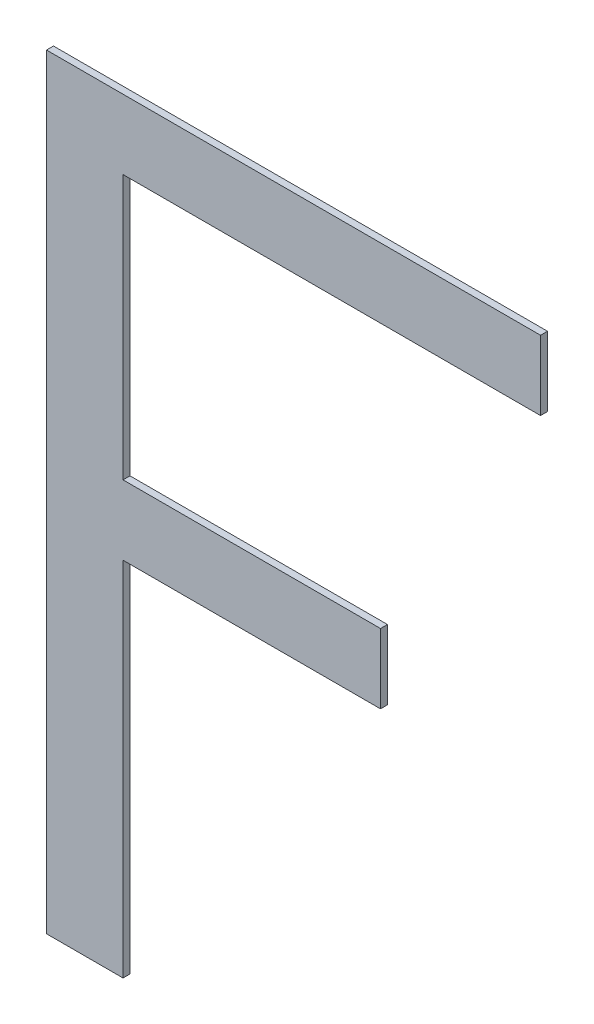
ISO-10303-21;
HEADER;
FILE_DESCRIPTION(('STEP AP214'),'2;1');
FILE_NAME('part.step','',(''),(''),'','','');
FILE_SCHEMA(('AUTOMOTIVE_DESIGN { 1 0 10303 214 1 1 1 1 }'));
ENDSEC;
DATA;
#1=APPLICATION_CONTEXT('core data for automotive mechanical design processes');
#2=APPLICATION_PROTOCOL_DEFINITION('international standard','automotive_design',2000,#1);
#3=PRODUCT_CONTEXT('',#1,'mechanical');
#4=PRODUCT('Part','Part','',(#3));
#5=PRODUCT_RELATED_PRODUCT_CATEGORY('part','',(#4));
#6=PRODUCT_DEFINITION_FORMATION('','',#4);
#7=PRODUCT_DEFINITION_CONTEXT('part definition',#1,'design');
#8=PRODUCT_DEFINITION('design','',#6,#7);
#9=PRODUCT_DEFINITION_SHAPE('','',#8);
#10=(LENGTH_UNIT() NAMED_UNIT(*) SI_UNIT(.MILLI.,.METRE.));
#11=(NAMED_UNIT(*) PLANE_ANGLE_UNIT() SI_UNIT($,.RADIAN.));
#12=(NAMED_UNIT(*) SI_UNIT($,.STERADIAN.) SOLID_ANGLE_UNIT());
#13=UNCERTAINTY_MEASURE_WITH_UNIT(LENGTH_MEASURE(1.E-05),#10,'distance_accuracy_value','');
#14=(GEOMETRIC_REPRESENTATION_CONTEXT(3) GLOBAL_UNCERTAINTY_ASSIGNED_CONTEXT((#13)) GLOBAL_UNIT_ASSIGNED_CONTEXT((#10,
#11,#12)) REPRESENTATION_CONTEXT('',''));
#15=CARTESIAN_POINT('',(0.,0.,0.));
#16=DIRECTION('',(0.,0.,1.));
#17=DIRECTION('',(1.,0.,0.));
#18=AXIS2_PLACEMENT_3D('',#15,#16,#17);
#19=CARTESIAN_POINT('',(-0.35500056,-0.5499989,0.01));
#20=DIRECTION('',(0.,0.,1.));
#21=DIRECTION('',(1.,0.,0.));
#22=AXIS2_PLACEMENT_3D('',#19,#20,#21);
#23=PLANE('',#22);
#24=DIRECTION('',(1.,0.,0.));
#25=VECTOR('',#24,1.);
#26=CARTESIAN_POINT('',(-0.35500056,0.55000144,0.01));
#27=LINE('',#26,#25);
#28=CARTESIAN_POINT('',(-0.35500056,0.55000144,0.01));
#29=VERTEX_POINT('',#28);
#30=CARTESIAN_POINT('',(0.35500056,0.55000144,0.01));
#31=VERTEX_POINT('',#30);
#32=EDGE_CURVE('E137',#29,#31,#27,.T.);
#33=ORIENTED_EDGE('',*,*,#32,.F.);
#34=DIRECTION('',(0.,1.,0.));
#35=VECTOR('',#34,1.);
#36=CARTESIAN_POINT('',(-0.35500056,-0.5499989,0.01));
#37=LINE('',#36,#35);
#38=CARTESIAN_POINT('',(-0.35500056,-0.5499989,0.01));
#39=VERTEX_POINT('',#38);
#40=EDGE_CURVE('E106',#39,#29,#37,.T.);
#41=ORIENTED_EDGE('',*,*,#40,.F.);
#42=DIRECTION('',(1.,0.,0.));
#43=VECTOR('',#42,1.);
#44=CARTESIAN_POINT('',(-0.24500078,-0.5499989,0.01));
#45=LINE('',#44,#43);
#46=CARTESIAN_POINT('',(-0.24500078,-0.5499989,0.01));
#47=VERTEX_POINT('',#46);
#48=EDGE_CURVE('E20',#47,#39,#45,.F.);
#49=ORIENTED_EDGE('',*,*,#48,.F.);
#50=DIRECTION('',(0.,1.,0.));
#51=VECTOR('',#50,1.);
#52=CARTESIAN_POINT('',(-0.24500078,-0.02999994,0.01));
#53=LINE('',#52,#51);
#54=CARTESIAN_POINT('',(-0.24500078,-0.02999994,0.01));
#55=VERTEX_POINT('',#54);
#56=EDGE_CURVE('E95',#55,#47,#53,.F.);
#57=ORIENTED_EDGE('',*,*,#56,.F.);
#58=DIRECTION('',(1.,0.,0.));
#59=VECTOR('',#58,1.);
#60=CARTESIAN_POINT('',(0.12500102,-0.02999994,0.01));
#61=LINE('',#60,#59);
#62=CARTESIAN_POINT('',(0.12500102,-0.02999994,0.01));
#63=VERTEX_POINT('',#62);
#64=EDGE_CURVE('E90',#63,#55,#61,.F.);
#65=ORIENTED_EDGE('',*,*,#64,.F.);
#66=DIRECTION('',(0.,1.,0.));
#67=VECTOR('',#66,1.);
#68=CARTESIAN_POINT('',(0.12500102,0.06999986,0.01));
#69=LINE('',#68,#67);
#70=CARTESIAN_POINT('',(0.12500102,0.06999986,0.01));
#71=VERTEX_POINT('',#70);
#72=EDGE_CURVE('E117',#71,#63,#69,.F.);
#73=ORIENTED_EDGE('',*,*,#72,.F.);
#74=DIRECTION('',(1.,0.,0.));
#75=VECTOR('',#74,1.);
#76=CARTESIAN_POINT('',(-0.24500078,0.06999986,0.01));
#77=LINE('',#76,#75);
#78=CARTESIAN_POINT('',(-0.24500078,0.06999986,0.01));
#79=VERTEX_POINT('',#78);
#80=EDGE_CURVE('E121',#79,#71,#77,.T.);
#81=ORIENTED_EDGE('',*,*,#80,.F.);
#82=DIRECTION('',(0.,1.,0.));
#83=VECTOR('',#82,1.);
#84=CARTESIAN_POINT('',(-0.24500078,0.45000164,0.01));
#85=LINE('',#84,#83);
#86=CARTESIAN_POINT('',(-0.24500078,0.45000164,0.01));
#87=VERTEX_POINT('',#86);
#88=EDGE_CURVE('E125',#87,#79,#85,.F.);
#89=ORIENTED_EDGE('',*,*,#88,.F.);
#90=DIRECTION('',(1.,0.,0.));
#91=VECTOR('',#90,1.);
#92=CARTESIAN_POINT('',(0.35500056,0.45000164,0.01));
#93=LINE('',#92,#91);
#94=CARTESIAN_POINT('',(0.35500056,0.45000164,0.01));
#95=VERTEX_POINT('',#94);
#96=EDGE_CURVE('E129',#95,#87,#93,.F.);
#97=ORIENTED_EDGE('',*,*,#96,.F.);
#98=DIRECTION('',(0.,1.,0.));
#99=VECTOR('',#98,1.);
#100=CARTESIAN_POINT('',(0.35500056,0.55000144,0.01));
#101=LINE('',#100,#99);
#102=EDGE_CURVE('E133',#31,#95,#101,.F.);
#103=ORIENTED_EDGE('',*,*,#102,.F.);
#104=EDGE_LOOP('',(#33,#41,#49,#57,#65,#73,#81,#89,#97,#103));
#105=FACE_BOUND('',#104,.T.);
#106=ADVANCED_FACE('F17',(#105),#23,.T.);
#107=CARTESIAN_POINT('',(-0.24500078,-0.5499989,0.));
#108=DIRECTION('',(0.,-1.,0.));
#109=DIRECTION('',(0.,0.,-1.));
#110=AXIS2_PLACEMENT_3D('',#107,#108,#109);
#111=PLANE('',#110);
#112=DIRECTION('',(0.,0.,1.));
#113=VECTOR('',#112,1.);
#114=CARTESIAN_POINT('',(-0.35500056,-0.5499989,0.));
#115=LINE('',#114,#113);
#116=CARTESIAN_POINT('',(-0.35500056,-0.5499989,0.));
#117=VERTEX_POINT('',#116);
#118=EDGE_CURVE('E141',#117,#39,#115,.T.);
#119=ORIENTED_EDGE('',*,*,#118,.F.);
#120=DIRECTION('',(1.,0.,0.));
#121=VECTOR('',#120,1.);
#122=CARTESIAN_POINT('',(-0.35500056,-0.5499989,0.));
#123=LINE('',#122,#121);
#124=CARTESIAN_POINT('',(-0.24500078,-0.5499989,0.));
#125=VERTEX_POINT('',#124);
#126=EDGE_CURVE('E112',#117,#125,#123,.T.);
#127=ORIENTED_EDGE('',*,*,#126,.T.);
#128=DIRECTION('',(0.,0.,-1.));
#129=VECTOR('',#128,1.);
#130=CARTESIAN_POINT('',(-0.24500078,-0.5499989,0.));
#131=LINE('',#130,#129);
#132=EDGE_CURVE('E100',#47,#125,#131,.T.);
#133=ORIENTED_EDGE('',*,*,#132,.F.);
#134=ORIENTED_EDGE('',*,*,#48,.T.);
#135=EDGE_LOOP('',(#119,#127,#133,#134));
#136=FACE_BOUND('',#135,.T.);
#137=ADVANCED_FACE('F111',(#136),#111,.T.);
#138=CARTESIAN_POINT('',(-0.24500078,-0.02999994,0.));
#139=DIRECTION('',(1.,0.,0.));
#140=DIRECTION('',(0.,0.,-1.));
#141=AXIS2_PLACEMENT_3D('',#138,#139,#140);
#142=PLANE('',#141);
#143=ORIENTED_EDGE('',*,*,#132,.T.);
#144=DIRECTION('',(0.,1.,0.));
#145=VECTOR('',#144,1.);
#146=CARTESIAN_POINT('',(-0.24500078,-0.5499989,0.));
#147=LINE('',#146,#145);
#148=CARTESIAN_POINT('',(-0.24500078,-0.02999994,0.));
#149=VERTEX_POINT('',#148);
#150=EDGE_CURVE('E146',#125,#149,#147,.T.);
#151=ORIENTED_EDGE('',*,*,#150,.T.);
#152=DIRECTION('',(0.,0.,-1.));
#153=VECTOR('',#152,1.);
#154=CARTESIAN_POINT('',(-0.24500078,-0.02999994,0.));
#155=LINE('',#154,#153);
#156=EDGE_CURVE('E102',#55,#149,#155,.T.);
#157=ORIENTED_EDGE('',*,*,#156,.F.);
#158=ORIENTED_EDGE('',*,*,#56,.T.);
#159=EDGE_LOOP('',(#143,#151,#157,#158));
#160=FACE_BOUND('',#159,.T.);
#161=ADVANCED_FACE('F97',(#160),#142,.T.);
#162=CARTESIAN_POINT('',(0.12500102,-0.02999994,0.));
#163=DIRECTION('',(0.,-1.,0.));
#164=DIRECTION('',(0.,0.,-1.));
#165=AXIS2_PLACEMENT_3D('',#162,#163,#164);
#166=PLANE('',#165);
#167=ORIENTED_EDGE('',*,*,#156,.T.);
#168=DIRECTION('',(1.,0.,0.));
#169=VECTOR('',#168,1.);
#170=CARTESIAN_POINT('',(-0.35500056,-0.02999994,0.));
#171=LINE('',#170,#169);
#172=CARTESIAN_POINT('',(0.12500102,-0.02999994,0.));
#173=VERTEX_POINT('',#172);
#174=EDGE_CURVE('E148',#149,#173,#171,.T.);
#175=ORIENTED_EDGE('',*,*,#174,.T.);
#176=DIRECTION('',(0.,0.,-1.));
#177=VECTOR('',#176,1.);
#178=CARTESIAN_POINT('',(0.12500102,-0.02999994,0.));
#179=LINE('',#178,#177);
#180=EDGE_CURVE('E119',#63,#173,#179,.T.);
#181=ORIENTED_EDGE('',*,*,#180,.F.);
#182=ORIENTED_EDGE('',*,*,#64,.T.);
#183=EDGE_LOOP('',(#167,#175,#181,#182));
#184=FACE_BOUND('',#183,.T.);
#185=ADVANCED_FACE('F198',(#184),#166,.T.);
#186=CARTESIAN_POINT('',(0.12500102,0.06999986,0.));
#187=DIRECTION('',(1.,0.,0.));
#188=DIRECTION('',(0.,0.,-1.));
#189=AXIS2_PLACEMENT_3D('',#186,#187,#188);
#190=PLANE('',#189);
#191=ORIENTED_EDGE('',*,*,#180,.T.);
#192=DIRECTION('',(0.,1.,0.));
#193=VECTOR('',#192,1.);
#194=CARTESIAN_POINT('',(0.12500102,-0.5499989,0.));
#195=LINE('',#194,#193);
#196=CARTESIAN_POINT('',(0.12500102,0.06999986,0.));
#197=VERTEX_POINT('',#196);
#198=EDGE_CURVE('E151',#173,#197,#195,.T.);
#199=ORIENTED_EDGE('',*,*,#198,.T.);
#200=DIRECTION('',(0.,0.,1.));
#201=VECTOR('',#200,1.);
#202=CARTESIAN_POINT('',(0.12500102,0.06999986,0.));
#203=LINE('',#202,#201);
#204=EDGE_CURVE('E123',#71,#197,#203,.F.);
#205=ORIENTED_EDGE('',*,*,#204,.F.);
#206=ORIENTED_EDGE('',*,*,#72,.T.);
#207=EDGE_LOOP('',(#191,#199,#205,#206));
#208=FACE_BOUND('',#207,.T.);
#209=ADVANCED_FACE('F197',(#208),#190,.T.);
#210=CARTESIAN_POINT('',(-0.24500078,0.06999986,0.));
#211=DIRECTION('',(0.,1.,0.));
#212=DIRECTION('',(0.,0.,1.));
#213=AXIS2_PLACEMENT_3D('',#210,#211,#212);
#214=PLANE('',#213);
#215=ORIENTED_EDGE('',*,*,#204,.T.);
#216=DIRECTION('',(1.,0.,0.));
#217=VECTOR('',#216,1.);
#218=CARTESIAN_POINT('',(-0.35500056,0.06999986,0.));
#219=LINE('',#218,#217);
#220=CARTESIAN_POINT('',(-0.24500078,0.06999986,0.));
#221=VERTEX_POINT('',#220);
#222=EDGE_CURVE('E154',#197,#221,#219,.F.);
#223=ORIENTED_EDGE('',*,*,#222,.T.);
#224=DIRECTION('',(0.,0.,-1.));
#225=VECTOR('',#224,1.);
#226=CARTESIAN_POINT('',(-0.24500078,0.06999986,0.));
#227=LINE('',#226,#225);
#228=EDGE_CURVE('E127',#79,#221,#227,.T.);
#229=ORIENTED_EDGE('',*,*,#228,.F.);
#230=ORIENTED_EDGE('',*,*,#80,.T.);
#231=EDGE_LOOP('',(#215,#223,#229,#230));
#232=FACE_BOUND('',#231,.T.);
#233=ADVANCED_FACE('F191',(#232),#214,.T.);
#234=CARTESIAN_POINT('',(-0.24500078,0.45000164,0.));
#235=DIRECTION('',(1.,0.,0.));
#236=DIRECTION('',(0.,0.,-1.));
#237=AXIS2_PLACEMENT_3D('',#234,#235,#236);
#238=PLANE('',#237);
#239=ORIENTED_EDGE('',*,*,#228,.T.);
#240=DIRECTION('',(0.,1.,0.));
#241=VECTOR('',#240,1.);
#242=CARTESIAN_POINT('',(-0.24500078,-0.5499989,0.));
#243=LINE('',#242,#241);
#244=CARTESIAN_POINT('',(-0.24500078,0.45000164,0.));
#245=VERTEX_POINT('',#244);
#246=EDGE_CURVE('E157',#221,#245,#243,.T.);
#247=ORIENTED_EDGE('',*,*,#246,.T.);
#248=DIRECTION('',(0.,0.,-1.));
#249=VECTOR('',#248,1.);
#250=CARTESIAN_POINT('',(-0.24500078,0.45000164,0.));
#251=LINE('',#250,#249);
#252=EDGE_CURVE('E131',#87,#245,#251,.T.);
#253=ORIENTED_EDGE('',*,*,#252,.F.);
#254=ORIENTED_EDGE('',*,*,#88,.T.);
#255=EDGE_LOOP('',(#239,#247,#253,#254));
#256=FACE_BOUND('',#255,.T.);
#257=ADVANCED_FACE('F187',(#256),#238,.T.);
#258=CARTESIAN_POINT('',(0.35500056,0.45000164,0.));
#259=DIRECTION('',(0.,-1.,0.));
#260=DIRECTION('',(0.,0.,-1.));
#261=AXIS2_PLACEMENT_3D('',#258,#259,#260);
#262=PLANE('',#261);
#263=ORIENTED_EDGE('',*,*,#252,.T.);
#264=DIRECTION('',(1.,0.,0.));
#265=VECTOR('',#264,1.);
#266=CARTESIAN_POINT('',(-0.35500056,0.45000164,0.));
#267=LINE('',#266,#265);
#268=CARTESIAN_POINT('',(0.35500056,0.45000164,0.));
#269=VERTEX_POINT('',#268);
#270=EDGE_CURVE('E160',#245,#269,#267,.T.);
#271=ORIENTED_EDGE('',*,*,#270,.T.);
#272=DIRECTION('',(0.,0.,-1.));
#273=VECTOR('',#272,1.);
#274=CARTESIAN_POINT('',(0.35500056,0.45000164,0.));
#275=LINE('',#274,#273);
#276=EDGE_CURVE('E135',#95,#269,#275,.T.);
#277=ORIENTED_EDGE('',*,*,#276,.F.);
#278=ORIENTED_EDGE('',*,*,#96,.T.);
#279=EDGE_LOOP('',(#263,#271,#277,#278));
#280=FACE_BOUND('',#279,.T.);
#281=ADVANCED_FACE('F181',(#280),#262,.T.);
#282=CARTESIAN_POINT('',(0.35500056,0.55000144,0.));
#283=DIRECTION('',(1.,0.,0.));
#284=DIRECTION('',(0.,0.,-1.));
#285=AXIS2_PLACEMENT_3D('',#282,#283,#284);
#286=PLANE('',#285);
#287=ORIENTED_EDGE('',*,*,#276,.T.);
#288=DIRECTION('',(0.,1.,0.));
#289=VECTOR('',#288,1.);
#290=CARTESIAN_POINT('',(0.35500056,-0.5499989,0.));
#291=LINE('',#290,#289);
#292=CARTESIAN_POINT('',(0.35500056,0.55000144,0.));
#293=VERTEX_POINT('',#292);
#294=EDGE_CURVE('E163',#269,#293,#291,.T.);
#295=ORIENTED_EDGE('',*,*,#294,.T.);
#296=DIRECTION('',(0.,0.,1.));
#297=VECTOR('',#296,1.);
#298=CARTESIAN_POINT('',(0.35500056,0.55000144,0.));
#299=LINE('',#298,#297);
#300=EDGE_CURVE('E139',#31,#293,#299,.F.);
#301=ORIENTED_EDGE('',*,*,#300,.F.);
#302=ORIENTED_EDGE('',*,*,#102,.T.);
#303=EDGE_LOOP('',(#287,#295,#301,#302));
#304=FACE_BOUND('',#303,.T.);
#305=ADVANCED_FACE('F176',(#304),#286,.T.);
#306=CARTESIAN_POINT('',(-0.35500056,0.55000144,0.));
#307=DIRECTION('',(0.,1.,0.));
#308=DIRECTION('',(0.,0.,1.));
#309=AXIS2_PLACEMENT_3D('',#306,#307,#308);
#310=PLANE('',#309);
#311=ORIENTED_EDGE('',*,*,#300,.T.);
#312=DIRECTION('',(1.,0.,0.));
#313=VECTOR('',#312,1.);
#314=CARTESIAN_POINT('',(-0.35500056,0.55000144,0.));
#315=LINE('',#314,#313);
#316=CARTESIAN_POINT('',(-0.35500056,0.55000144,0.));
#317=VERTEX_POINT('',#316);
#318=EDGE_CURVE('E26',#293,#317,#315,.F.);
#319=ORIENTED_EDGE('',*,*,#318,.T.);
#320=DIRECTION('',(0.,0.,1.));
#321=VECTOR('',#320,1.);
#322=CARTESIAN_POINT('',(-0.35500056,0.55000144,0.));
#323=LINE('',#322,#321);
#324=EDGE_CURVE('E34',#29,#317,#323,.F.);
#325=ORIENTED_EDGE('',*,*,#324,.F.);
#326=ORIENTED_EDGE('',*,*,#32,.T.);
#327=EDGE_LOOP('',(#311,#319,#325,#326));
#328=FACE_BOUND('',#327,.T.);
#329=ADVANCED_FACE('F169',(#328),#310,.T.);
#330=CARTESIAN_POINT('',(-0.35500056,-0.5499989,0.));
#331=DIRECTION('',(-1.,0.,0.));
#332=DIRECTION('',(0.,0.,1.));
#333=AXIS2_PLACEMENT_3D('',#330,#331,#332);
#334=PLANE('',#333);
#335=ORIENTED_EDGE('',*,*,#324,.T.);
#336=DIRECTION('',(0.,1.,0.));
#337=VECTOR('',#336,1.);
#338=CARTESIAN_POINT('',(-0.35500056,-0.5499989,0.));
#339=LINE('',#338,#337);
#340=EDGE_CURVE('E11',#317,#117,#339,.F.);
#341=ORIENTED_EDGE('',*,*,#340,.T.);
#342=ORIENTED_EDGE('',*,*,#118,.T.);
#343=ORIENTED_EDGE('',*,*,#40,.T.);
#344=EDGE_LOOP('',(#335,#341,#342,#343));
#345=FACE_BOUND('',#344,.T.);
#346=ADVANCED_FACE('F199',(#345),#334,.T.);
#347=CARTESIAN_POINT('',(-0.35500056,-0.5499989,0.));
#348=DIRECTION('',(0.,0.,1.));
#349=DIRECTION('',(1.,0.,0.));
#350=AXIS2_PLACEMENT_3D('',#347,#348,#349);
#351=PLANE('',#350);
#352=ORIENTED_EDGE('',*,*,#318,.F.);
#353=ORIENTED_EDGE('',*,*,#294,.F.);
#354=ORIENTED_EDGE('',*,*,#270,.F.);
#355=ORIENTED_EDGE('',*,*,#246,.F.);
#356=ORIENTED_EDGE('',*,*,#222,.F.);
#357=ORIENTED_EDGE('',*,*,#198,.F.);
#358=ORIENTED_EDGE('',*,*,#174,.F.);
#359=ORIENTED_EDGE('',*,*,#150,.F.);
#360=ORIENTED_EDGE('',*,*,#126,.F.);
#361=ORIENTED_EDGE('',*,*,#340,.F.);
#362=EDGE_LOOP('',(#352,#353,#354,#355,#356,#357,#358,#359,#360,#361));
#363=FACE_BOUND('',#362,.T.);
#364=ADVANCED_FACE('F173',(#363),#351,.F.);
#365=CLOSED_SHELL('',(#106,#137,#161,#185,#209,#233,#257,#281,#305,#329,#346,#364));
#366=MANIFOLD_SOLID_BREP('B1',#365);
#367=ADVANCED_BREP_SHAPE_REPRESENTATION('',(#18,#366),#14);
#368=SHAPE_DEFINITION_REPRESENTATION(#9,#367);
ENDSEC;
END-ISO-10303-21;
